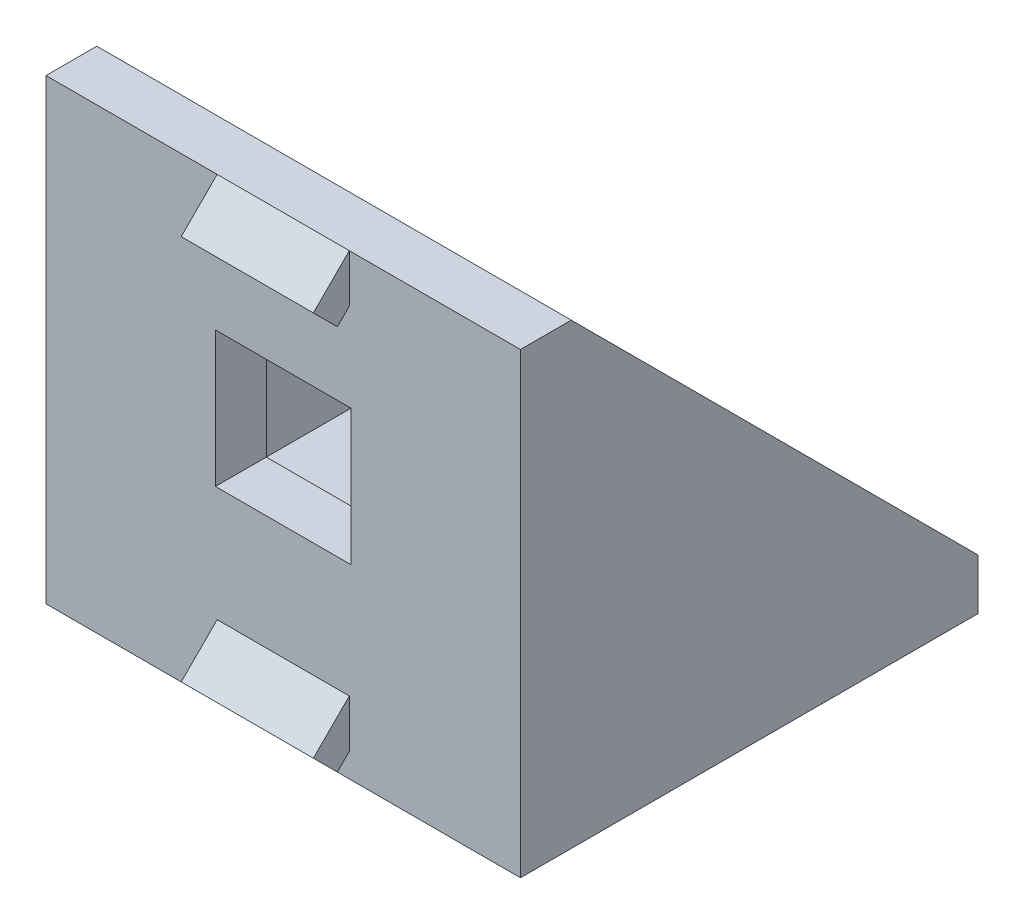
ISO-10303-21;
HEADER;
FILE_DESCRIPTION(('STEP AP214'),'2;1');
FILE_NAME('part.step','',(''),(''),'','','');
FILE_SCHEMA(('AUTOMOTIVE_DESIGN { 1 0 10303 214 1 1 1 1 }'));
ENDSEC;
DATA;
#1=APPLICATION_CONTEXT('core data for automotive mechanical design processes');
#2=APPLICATION_PROTOCOL_DEFINITION('international standard','automotive_design',2000,#1);
#3=PRODUCT_CONTEXT('',#1,'mechanical');
#4=PRODUCT('Part','Part','',(#3));
#5=PRODUCT_RELATED_PRODUCT_CATEGORY('part','',(#4));
#6=PRODUCT_DEFINITION_FORMATION('','',#4);
#7=PRODUCT_DEFINITION_CONTEXT('part definition',#1,'design');
#8=PRODUCT_DEFINITION('design','',#6,#7);
#9=PRODUCT_DEFINITION_SHAPE('','',#8);
#10=(LENGTH_UNIT() NAMED_UNIT(*) SI_UNIT(.MILLI.,.METRE.));
#11=(NAMED_UNIT(*) PLANE_ANGLE_UNIT() SI_UNIT($,.RADIAN.));
#12=(NAMED_UNIT(*) SI_UNIT($,.STERADIAN.) SOLID_ANGLE_UNIT());
#13=UNCERTAINTY_MEASURE_WITH_UNIT(LENGTH_MEASURE(1.E-05),#10,'distance_accuracy_value','');
#14=(GEOMETRIC_REPRESENTATION_CONTEXT(3) GLOBAL_UNCERTAINTY_ASSIGNED_CONTEXT((#13)) GLOBAL_UNIT_ASSIGNED_CONTEXT((#10,
#11,#12)) REPRESENTATION_CONTEXT('',''));
#15=CARTESIAN_POINT('',(0.,0.,0.));
#16=DIRECTION('',(0.,0.,1.));
#17=DIRECTION('',(1.,0.,0.));
#18=AXIS2_PLACEMENT_3D('',#15,#16,#17);
#19=CARTESIAN_POINT('',(28.,0.,0.));
#20=DIRECTION('',(0.,1.,0.));
#21=DIRECTION('',(0.,0.,1.));
#22=AXIS2_PLACEMENT_3D('',#19,#20,#21);
#23=PLANE('',#22);
#24=DIRECTION('',(-1.,0.,0.));
#25=VECTOR('',#24,1.);
#26=CARTESIAN_POINT('',(28.,0.,-27.));
#27=LINE('',#26,#25);
#28=CARTESIAN_POINT('',(10.1,0.,-27.));
#29=VERTEX_POINT('',#28);
#30=CARTESIAN_POINT('',(0.,0.,-27.));
#31=VERTEX_POINT('',#30);
#32=EDGE_CURVE('E571',#29,#31,#27,.T.);
#33=ORIENTED_EDGE('',*,*,#32,.F.);
#34=DIRECTION('',(0.,0.,1.));
#35=VECTOR('',#34,1.);
#36=CARTESIAN_POINT('',(10.1,0.,-24.1715728752538));
#37=LINE('',#36,#35);
#38=CARTESIAN_POINT('',(10.1,0.,-24.1715728752538));
#39=VERTEX_POINT('',#38);
#40=EDGE_CURVE('E365',#29,#39,#37,.T.);
#41=ORIENTED_EDGE('',*,*,#40,.T.);
#42=DIRECTION('',(-1.,0.,0.));
#43=VECTOR('',#42,1.);
#44=CARTESIAN_POINT('',(17.9,0.,-24.1715728752538));
#45=LINE('',#44,#43);
#46=CARTESIAN_POINT('',(17.9,0.,-24.1715728752538));
#47=VERTEX_POINT('',#46);
#48=EDGE_CURVE('E404',#47,#39,#45,.T.);
#49=ORIENTED_EDGE('',*,*,#48,.F.);
#50=DIRECTION('',(0.,0.,1.));
#51=VECTOR('',#50,1.);
#52=CARTESIAN_POINT('',(17.9,0.,-24.1715728752538));
#53=LINE('',#52,#51);
#54=CARTESIAN_POINT('',(17.9,0.,-27.));
#55=VERTEX_POINT('',#54);
#56=EDGE_CURVE('E366',#55,#47,#53,.T.);
#57=ORIENTED_EDGE('',*,*,#56,.F.);
#58=CARTESIAN_POINT('',(28.,0.,-27.));
#59=VERTEX_POINT('',#58);
#60=EDGE_CURVE('E572',#59,#55,#27,.T.);
#61=ORIENTED_EDGE('',*,*,#60,.F.);
#62=DIRECTION('',(0.,0.,-1.));
#63=VECTOR('',#62,1.);
#64=CARTESIAN_POINT('',(28.,0.,0.));
#65=LINE('',#64,#63);
#66=CARTESIAN_POINT('',(28.,0.,0.));
#67=VERTEX_POINT('',#66);
#68=EDGE_CURVE('E519',#67,#59,#65,.T.);
#69=ORIENTED_EDGE('',*,*,#68,.F.);
#70=DIRECTION('',(-1.,0.,0.));
#71=VECTOR('',#70,1.);
#72=CARTESIAN_POINT('',(28.,0.,0.));
#73=LINE('',#72,#71);
#74=CARTESIAN_POINT('',(0.,0.,0.));
#75=VERTEX_POINT('',#74);
#76=EDGE_CURVE('E536',#67,#75,#73,.T.);
#77=ORIENTED_EDGE('',*,*,#76,.T.);
#78=DIRECTION('',(0.,0.,-1.));
#79=VECTOR('',#78,1.);
#80=CARTESIAN_POINT('',(0.,0.,0.));
#81=LINE('',#80,#79);
#82=EDGE_CURVE('E518',#75,#31,#81,.T.);
#83=ORIENTED_EDGE('',*,*,#82,.T.);
#84=EDGE_LOOP('',(#33,#41,#49,#57,#61,#69,#77,#83));
#85=FACE_BOUND('',#84,.T.);
#86=DIRECTION('',(1.,0.,0.));
#87=VECTOR('',#86,1.);
#88=CARTESIAN_POINT('',(10.,0.,-19.));
#89=LINE('',#88,#87);
#90=CARTESIAN_POINT('',(10.,0.,-19.));
#91=VERTEX_POINT('',#90);
#92=CARTESIAN_POINT('',(18.,0.,-19.));
#93=VERTEX_POINT('',#92);
#94=EDGE_CURVE('E411',#91,#93,#89,.T.);
#95=ORIENTED_EDGE('',*,*,#94,.F.);
#96=DIRECTION('',(0.,0.,-1.));
#97=VECTOR('',#96,1.);
#98=CARTESIAN_POINT('',(10.,0.,-11.));
#99=LINE('',#98,#97);
#100=CARTESIAN_POINT('',(10.,0.,-11.));
#101=VERTEX_POINT('',#100);
#102=EDGE_CURVE('E415',#101,#91,#99,.T.);
#103=ORIENTED_EDGE('',*,*,#102,.F.);
#104=DIRECTION('',(-1.,0.,0.));
#105=VECTOR('',#104,1.);
#106=CARTESIAN_POINT('',(10.,0.,-11.));
#107=LINE('',#106,#105);
#108=CARTESIAN_POINT('',(18.,0.,-11.));
#109=VERTEX_POINT('',#108);
#110=EDGE_CURVE('E438',#109,#101,#107,.T.);
#111=ORIENTED_EDGE('',*,*,#110,.F.);
#112=DIRECTION('',(0.,0.,1.));
#113=VECTOR('',#112,1.);
#114=CARTESIAN_POINT('',(18.,0.,-11.));
#115=LINE('',#114,#113);
#116=EDGE_CURVE('E408',#93,#109,#115,.T.);
#117=ORIENTED_EDGE('',*,*,#116,.F.);
#118=EDGE_LOOP('',(#95,#103,#111,#117));
#119=FACE_BOUND('',#118,.T.);
#120=DIRECTION('',(0.,0.,1.));
#121=VECTOR('',#120,1.);
#122=CARTESIAN_POINT('',(17.9,0.,-1.41421356237308));
#123=LINE('',#122,#121);
#124=CARTESIAN_POINT('',(17.9,0.,-4.24264068711928));
#125=VERTEX_POINT('',#124);
#126=CARTESIAN_POINT('',(17.9,0.,-1.41421356237308));
#127=VERTEX_POINT('',#126);
#128=EDGE_CURVE('E325',#125,#127,#123,.T.);
#129=ORIENTED_EDGE('',*,*,#128,.F.);
#130=DIRECTION('',(-1.,0.,0.));
#131=VECTOR('',#130,1.);
#132=CARTESIAN_POINT('',(17.9,0.,-4.24264068711928));
#133=LINE('',#132,#131);
#134=CARTESIAN_POINT('',(10.1,0.,-4.24264068711928));
#135=VERTEX_POINT('',#134);
#136=EDGE_CURVE('E339',#125,#135,#133,.T.);
#137=ORIENTED_EDGE('',*,*,#136,.T.);
#138=DIRECTION('',(0.,0.,1.));
#139=VECTOR('',#138,1.);
#140=CARTESIAN_POINT('',(10.1,0.,-1.41421356237308));
#141=LINE('',#140,#139);
#142=CARTESIAN_POINT('',(10.1,0.,-1.41421356237308));
#143=VERTEX_POINT('',#142);
#144=EDGE_CURVE('E324',#135,#143,#141,.T.);
#145=ORIENTED_EDGE('',*,*,#144,.T.);
#146=DIRECTION('',(-1.,0.,0.));
#147=VECTOR('',#146,1.);
#148=CARTESIAN_POINT('',(17.9,0.,-1.41421356237308));
#149=LINE('',#148,#147);
#150=EDGE_CURVE('E362',#127,#143,#149,.T.);
#151=ORIENTED_EDGE('',*,*,#150,.F.);
#152=EDGE_LOOP('',(#129,#137,#145,#151));
#153=FACE_BOUND('',#152,.T.);
#154=ADVANCED_FACE('F41',(#85,#119,#153),#23,.F.);
#155=CARTESIAN_POINT('',(28.,27.,-3.));
#156=DIRECTION('',(0.,-0.707106781186547,0.707106781186547));
#157=DIRECTION('',(0.,-0.707106781186548,-0.707106781186548));
#158=AXIS2_PLACEMENT_3D('',#155,#156,#157);
#159=PLANE('',#158);
#160=DIRECTION('',(-1.,0.,0.));
#161=VECTOR('',#160,1.);
#162=CARTESIAN_POINT('',(28.,27.,-3.));
#163=LINE('',#162,#161);
#164=CARTESIAN_POINT('',(2.,27.,-3.));
#165=VERTEX_POINT('',#164);
#166=CARTESIAN_POINT('',(0.,27.,-3.));
#167=VERTEX_POINT('',#166);
#168=EDGE_CURVE('E561',#165,#167,#163,.T.);
#169=ORIENTED_EDGE('',*,*,#168,.F.);
#170=DIRECTION('',(0.,-0.707106781186547,-0.707106781186547));
#171=VECTOR('',#170,1.);
#172=CARTESIAN_POINT('',(2.,27.,-3.));
#173=LINE('',#172,#171);
#174=CARTESIAN_POINT('',(2.,3.,-27.));
#175=VERTEX_POINT('',#174);
#176=EDGE_CURVE('E12',#165,#175,#173,.T.);
#177=ORIENTED_EDGE('',*,*,#176,.T.);
#178=DIRECTION('',(-1.,0.,0.));
#179=VECTOR('',#178,1.);
#180=CARTESIAN_POINT('',(28.,3.,-27.));
#181=LINE('',#180,#179);
#182=CARTESIAN_POINT('',(0.,3.,-27.));
#183=VERTEX_POINT('',#182);
#184=EDGE_CURVE('E566',#175,#183,#181,.T.);
#185=ORIENTED_EDGE('',*,*,#184,.T.);
#186=DIRECTION('',(0.,0.707106781186548,0.707106781186548));
#187=VECTOR('',#186,1.);
#188=CARTESIAN_POINT('',(0.,27.,-3.));
#189=LINE('',#188,#187);
#190=EDGE_CURVE('E544',#183,#167,#189,.T.);
#191=ORIENTED_EDGE('',*,*,#190,.T.);
#192=EDGE_LOOP('',(#169,#177,#185,#191));
#193=FACE_BOUND('',#192,.T.);
#194=ADVANCED_FACE('F605',(#193),#159,.F.);
#195=CARTESIAN_POINT('',(28.,3.,-27.));
#196=DIRECTION('',(0.,0.,1.));
#197=DIRECTION('',(1.,0.,0.));
#198=AXIS2_PLACEMENT_3D('',#195,#196,#197);
#199=PLANE('',#198);
#200=DIRECTION('',(0.,1.,0.));
#201=VECTOR('',#200,1.);
#202=CARTESIAN_POINT('',(0.,3.,-27.));
#203=LINE('',#202,#201);
#204=EDGE_CURVE('E540',#31,#183,#203,.T.);
#205=ORIENTED_EDGE('',*,*,#204,.T.);
#206=ORIENTED_EDGE('',*,*,#184,.F.);
#207=DIRECTION('',(-1.,0.,0.));
#208=VECTOR('',#207,1.);
#209=CARTESIAN_POINT('',(2.,3.,-27.));
#210=LINE('',#209,#208);
#211=CARTESIAN_POINT('',(26.,3.,-27.));
#212=VERTEX_POINT('',#211);
#213=EDGE_CURVE('E494',#212,#175,#210,.T.);
#214=ORIENTED_EDGE('',*,*,#213,.F.);
#215=CARTESIAN_POINT('',(28.,3.,-27.));
#216=VERTEX_POINT('',#215);
#217=EDGE_CURVE('E567',#216,#212,#181,.T.);
#218=ORIENTED_EDGE('',*,*,#217,.F.);
#219=DIRECTION('',(0.,1.,0.));
#220=VECTOR('',#219,1.);
#221=CARTESIAN_POINT('',(28.,3.,-27.));
#222=LINE('',#221,#220);
#223=EDGE_CURVE('E523',#59,#216,#222,.T.);
#224=ORIENTED_EDGE('',*,*,#223,.F.);
#225=ORIENTED_EDGE('',*,*,#60,.T.);
#226=DIRECTION('',(-1.,0.,0.));
#227=VECTOR('',#226,1.);
#228=CARTESIAN_POINT('',(17.9,0.,-27.));
#229=LINE('',#228,#227);
#230=EDGE_CURVE('E381',#55,#29,#229,.T.);
#231=ORIENTED_EDGE('',*,*,#230,.T.);
#232=ORIENTED_EDGE('',*,*,#32,.T.);
#233=EDGE_LOOP('',(#205,#206,#214,#218,#224,#225,#231,#232));
#234=FACE_BOUND('',#233,.T.);
#235=ADVANCED_FACE('F597',(#234),#199,.F.);
#236=ORIENTED_EDGE('',*,*,#217,.T.);
#237=DIRECTION('',(0.,0.707106781186547,0.707106781186547));
#238=VECTOR('',#237,1.);
#239=CARTESIAN_POINT('',(26.,27.,-3.));
#240=LINE('',#239,#238);
#241=CARTESIAN_POINT('',(26.,27.,-2.99999999999999));
#242=VERTEX_POINT('',#241);
#243=EDGE_CURVE('E49',#212,#242,#240,.T.);
#244=ORIENTED_EDGE('',*,*,#243,.T.);
#245=CARTESIAN_POINT('',(28.,27.,-3.));
#246=VERTEX_POINT('',#245);
#247=EDGE_CURVE('E562',#246,#242,#163,.T.);
#248=ORIENTED_EDGE('',*,*,#247,.F.);
#249=DIRECTION('',(0.,0.707106781186548,0.707106781186548));
#250=VECTOR('',#249,1.);
#251=CARTESIAN_POINT('',(28.,27.,-3.));
#252=LINE('',#251,#250);
#253=EDGE_CURVE('E527',#216,#246,#252,.T.);
#254=ORIENTED_EDGE('',*,*,#253,.F.);
#255=EDGE_LOOP('',(#236,#244,#248,#254));
#256=FACE_BOUND('',#255,.T.);
#257=ADVANCED_FACE('F579',(#256),#159,.F.);
#258=CARTESIAN_POINT('',(28.,27.,0.));
#259=DIRECTION('',(0.,-1.,0.));
#260=DIRECTION('',(0.,0.,-1.));
#261=AXIS2_PLACEMENT_3D('',#258,#259,#260);
#262=PLANE('',#261);
#263=DIRECTION('',(0.,0.,1.));
#264=VECTOR('',#263,1.);
#265=CARTESIAN_POINT('',(0.,27.,0.));
#266=LINE('',#265,#264);
#267=CARTESIAN_POINT('',(0.,27.,0.));
#268=VERTEX_POINT('',#267);
#269=EDGE_CURVE('E548',#167,#268,#266,.T.);
#270=ORIENTED_EDGE('',*,*,#269,.T.);
#271=DIRECTION('',(-1.,0.,0.));
#272=VECTOR('',#271,1.);
#273=CARTESIAN_POINT('',(28.,27.,0.));
#274=LINE('',#273,#272);
#275=CARTESIAN_POINT('',(10.1,27.,0.));
#276=VERTEX_POINT('',#275);
#277=EDGE_CURVE('E557',#276,#268,#274,.T.);
#278=ORIENTED_EDGE('',*,*,#277,.F.);
#279=DIRECTION('',(-1.,0.,0.));
#280=VECTOR('',#279,1.);
#281=CARTESIAN_POINT('',(17.9,27.,0.));
#282=LINE('',#281,#280);
#283=CARTESIAN_POINT('',(17.9,27.,0.));
#284=VERTEX_POINT('',#283);
#285=EDGE_CURVE('E755',#284,#276,#282,.T.);
#286=ORIENTED_EDGE('',*,*,#285,.F.);
#287=CARTESIAN_POINT('',(28.,27.,0.));
#288=VERTEX_POINT('',#287);
#289=EDGE_CURVE('E558',#288,#284,#274,.T.);
#290=ORIENTED_EDGE('',*,*,#289,.F.);
#291=DIRECTION('',(0.,0.,1.));
#292=VECTOR('',#291,1.);
#293=CARTESIAN_POINT('',(28.,27.,0.));
#294=LINE('',#293,#292);
#295=EDGE_CURVE('E530',#246,#288,#294,.T.);
#296=ORIENTED_EDGE('',*,*,#295,.F.);
#297=ORIENTED_EDGE('',*,*,#247,.T.);
#298=DIRECTION('',(-1.,0.,0.));
#299=VECTOR('',#298,1.);
#300=CARTESIAN_POINT('',(2.,27.,-3.));
#301=LINE('',#300,#299);
#302=EDGE_CURVE('E505',#242,#165,#301,.T.);
#303=ORIENTED_EDGE('',*,*,#302,.T.);
#304=ORIENTED_EDGE('',*,*,#168,.T.);
#305=EDGE_LOOP('',(#270,#278,#286,#290,#296,#297,#303,#304));
#306=FACE_BOUND('',#305,.T.);
#307=ADVANCED_FACE('F586',(#306),#262,.F.);
#308=CARTESIAN_POINT('',(28.,0.,0.));
#309=DIRECTION('',(0.,0.,-1.));
#310=DIRECTION('',(-1.,0.,0.));
#311=AXIS2_PLACEMENT_3D('',#308,#309,#310);
#312=PLANE('',#311);
#313=DIRECTION('',(-1.,0.,0.));
#314=VECTOR('',#313,1.);
#315=CARTESIAN_POINT('',(17.9,4.24264068711882,-1.56502576304842E-13));
#316=LINE('',#315,#314);
#317=CARTESIAN_POINT('',(17.9,4.24264068711866,0.));
#318=VERTEX_POINT('',#317);
#319=CARTESIAN_POINT('',(10.1,4.24264068711882,0.));
#320=VERTEX_POINT('',#319);
#321=EDGE_CURVE('E300',#318,#320,#316,.T.);
#322=ORIENTED_EDGE('',*,*,#321,.F.);
#323=DIRECTION('',(0.,1.,-1.65607518986913E-13));
#324=VECTOR('',#323,1.);
#325=CARTESIAN_POINT('',(17.9,1.4142135623733,3.11906222459551E-13));
#326=LINE('',#325,#324);
#327=CARTESIAN_POINT('',(17.9,1.41421356237361,0.));
#328=VERTEX_POINT('',#327);
#329=EDGE_CURVE('E297',#328,#318,#326,.T.);
#330=ORIENTED_EDGE('',*,*,#329,.F.);
#331=DIRECTION('',(-1.,0.,0.));
#332=VECTOR('',#331,1.);
#333=CARTESIAN_POINT('',(17.9,1.4142135623733,3.11906222459551E-13));
#334=LINE('',#333,#332);
#335=CARTESIAN_POINT('',(10.1,1.4142135623733,3.11906222459551E-13));
#336=VERTEX_POINT('',#335);
#337=EDGE_CURVE('E313',#328,#336,#334,.T.);
#338=ORIENTED_EDGE('',*,*,#337,.T.);
#339=DIRECTION('',(0.,1.,-1.65607518986913E-13));
#340=VECTOR('',#339,1.);
#341=CARTESIAN_POINT('',(10.1,1.4142135623733,3.11906222459551E-13));
#342=LINE('',#341,#340);
#343=EDGE_CURVE('E290',#336,#320,#342,.T.);
#344=ORIENTED_EDGE('',*,*,#343,.T.);
#345=EDGE_LOOP('',(#322,#330,#338,#344));
#346=FACE_BOUND('',#345,.T.);
#347=DIRECTION('',(1.,0.,0.));
#348=VECTOR('',#347,1.);
#349=CARTESIAN_POINT('',(10.,11.,0.));
#350=LINE('',#349,#348);
#351=CARTESIAN_POINT('',(10.,11.,0.));
#352=VERTEX_POINT('',#351);
#353=CARTESIAN_POINT('',(18.,11.,0.));
#354=VERTEX_POINT('',#353);
#355=EDGE_CURVE('E454',#352,#354,#350,.T.);
#356=ORIENTED_EDGE('',*,*,#355,.F.);
#357=DIRECTION('',(0.,-1.,0.));
#358=VECTOR('',#357,1.);
#359=CARTESIAN_POINT('',(10.,19.,0.));
#360=LINE('',#359,#358);
#361=CARTESIAN_POINT('',(10.,19.,0.));
#362=VERTEX_POINT('',#361);
#363=EDGE_CURVE('E458',#362,#352,#360,.T.);
#364=ORIENTED_EDGE('',*,*,#363,.F.);
#365=DIRECTION('',(-1.,0.,0.));
#366=VECTOR('',#365,1.);
#367=CARTESIAN_POINT('',(10.,19.,0.));
#368=LINE('',#367,#366);
#369=CARTESIAN_POINT('',(18.,19.,0.));
#370=VERTEX_POINT('',#369);
#371=EDGE_CURVE('E481',#370,#362,#368,.T.);
#372=ORIENTED_EDGE('',*,*,#371,.F.);
#373=DIRECTION('',(0.,1.,0.));
#374=VECTOR('',#373,1.);
#375=CARTESIAN_POINT('',(18.,19.,0.));
#376=LINE('',#375,#374);
#377=EDGE_CURVE('E451',#354,#370,#376,.T.);
#378=ORIENTED_EDGE('',*,*,#377,.F.);
#379=EDGE_LOOP('',(#356,#364,#372,#378));
#380=FACE_BOUND('',#379,.T.);
#381=ORIENTED_EDGE('',*,*,#289,.T.);
#382=DIRECTION('',(0.,1.,-2.38185905000715E-13));
#383=VECTOR('',#382,1.);
#384=CARTESIAN_POINT('',(17.9,27.,0.));
#385=LINE('',#384,#383);
#386=CARTESIAN_POINT('',(17.9,24.1715728752552,0.));
#387=VERTEX_POINT('',#386);
#388=EDGE_CURVE('E56',#387,#284,#385,.T.);
#389=ORIENTED_EDGE('',*,*,#388,.F.);
#390=DIRECTION('',(-1.,0.,0.));
#391=VECTOR('',#390,1.);
#392=CARTESIAN_POINT('',(17.9,24.1715728752545,6.73691474436078E-13));
#393=LINE('',#392,#391);
#394=CARTESIAN_POINT('',(10.1,24.1715728752545,6.73691474436078E-13));
#395=VERTEX_POINT('',#394);
#396=EDGE_CURVE('E281',#387,#395,#393,.T.);
#397=ORIENTED_EDGE('',*,*,#396,.T.);
#398=DIRECTION('',(0.,1.,-2.38185905000715E-13));
#399=VECTOR('',#398,1.);
#400=CARTESIAN_POINT('',(10.1,27.,0.));
#401=LINE('',#400,#399);
#402=EDGE_CURVE('E62',#395,#276,#401,.T.);
#403=ORIENTED_EDGE('',*,*,#402,.T.);
#404=ORIENTED_EDGE('',*,*,#277,.T.);
#405=DIRECTION('',(0.,-1.,0.));
#406=VECTOR('',#405,1.);
#407=CARTESIAN_POINT('',(0.,0.,0.));
#408=LINE('',#407,#406);
#409=EDGE_CURVE('E524',#268,#75,#408,.T.);
#410=ORIENTED_EDGE('',*,*,#409,.T.);
#411=ORIENTED_EDGE('',*,*,#76,.F.);
#412=DIRECTION('',(0.,-1.,0.));
#413=VECTOR('',#412,1.);
#414=CARTESIAN_POINT('',(28.,0.,0.));
#415=LINE('',#414,#413);
#416=EDGE_CURVE('E533',#288,#67,#415,.T.);
#417=ORIENTED_EDGE('',*,*,#416,.F.);
#418=EDGE_LOOP('',(#381,#389,#397,#403,#404,#410,#411,#417));
#419=FACE_BOUND('',#418,.T.);
#420=ADVANCED_FACE('F731',(#346,#380,#419),#312,.F.);
#421=CARTESIAN_POINT('',(28.,0.,0.));
#422=DIRECTION('',(-1.,0.,0.));
#423=DIRECTION('',(0.,0.,1.));
#424=AXIS2_PLACEMENT_3D('',#421,#422,#423);
#425=PLANE('',#424);
#426=ORIENTED_EDGE('',*,*,#68,.T.);
#427=ORIENTED_EDGE('',*,*,#223,.T.);
#428=ORIENTED_EDGE('',*,*,#253,.T.);
#429=ORIENTED_EDGE('',*,*,#295,.T.);
#430=ORIENTED_EDGE('',*,*,#416,.T.);
#431=EDGE_LOOP('',(#426,#427,#428,#429,#430));
#432=FACE_BOUND('',#431,.T.);
#433=ADVANCED_FACE('F591',(#432),#425,.F.);
#434=CARTESIAN_POINT('',(0.,0.,0.));
#435=DIRECTION('',(-1.,0.,0.));
#436=DIRECTION('',(0.,0.,1.));
#437=AXIS2_PLACEMENT_3D('',#434,#435,#436);
#438=PLANE('',#437);
#439=ORIENTED_EDGE('',*,*,#82,.F.);
#440=ORIENTED_EDGE('',*,*,#409,.F.);
#441=ORIENTED_EDGE('',*,*,#269,.F.);
#442=ORIENTED_EDGE('',*,*,#190,.F.);
#443=ORIENTED_EDGE('',*,*,#204,.F.);
#444=EDGE_LOOP('',(#439,#440,#441,#442,#443));
#445=FACE_BOUND('',#444,.T.);
#446=ADVANCED_FACE('F621',(#445),#438,.T.);
#447=CARTESIAN_POINT('',(2.,3.,33.9411254969543));
#448=DIRECTION('',(-1.,0.,0.));
#449=DIRECTION('',(0.,0.,1.));
#450=AXIS2_PLACEMENT_3D('',#447,#448,#449);
#451=PLANE('',#450);
#452=DIRECTION('',(0.,-1.,0.));
#453=VECTOR('',#452,1.);
#454=CARTESIAN_POINT('',(2.,3.,-3.));
#455=LINE('',#454,#453);
#456=CARTESIAN_POINT('',(2.,3.,-3.));
#457=VERTEX_POINT('',#456);
#458=EDGE_CURVE('E502',#165,#457,#455,.T.);
#459=ORIENTED_EDGE('',*,*,#458,.T.);
#460=DIRECTION('',(0.,0.,-1.));
#461=VECTOR('',#460,1.);
#462=CARTESIAN_POINT('',(2.,3.,33.9411254969543));
#463=LINE('',#462,#461);
#464=EDGE_CURVE('E499',#457,#175,#463,.T.);
#465=ORIENTED_EDGE('',*,*,#464,.T.);
#466=ORIENTED_EDGE('',*,*,#176,.F.);
#467=EDGE_LOOP('',(#459,#465,#466));
#468=FACE_BOUND('',#467,.T.);
#469=ADVANCED_FACE('F607',(#468),#451,.F.);
#470=CARTESIAN_POINT('',(26.,3.,33.9411254969543));
#471=DIRECTION('',(1.,0.,0.));
#472=DIRECTION('',(0.,0.,-1.));
#473=AXIS2_PLACEMENT_3D('',#470,#471,#472);
#474=PLANE('',#473);
#475=DIRECTION('',(0.,0.,-1.));
#476=VECTOR('',#475,1.);
#477=CARTESIAN_POINT('',(26.,3.,33.9411254969543));
#478=LINE('',#477,#476);
#479=CARTESIAN_POINT('',(26.,3.,-3.));
#480=VERTEX_POINT('',#479);
#481=EDGE_CURVE('E509',#480,#212,#478,.T.);
#482=ORIENTED_EDGE('',*,*,#481,.F.);
#483=DIRECTION('',(0.,1.,0.));
#484=VECTOR('',#483,1.);
#485=CARTESIAN_POINT('',(26.,3.,-3.));
#486=LINE('',#485,#484);
#487=EDGE_CURVE('E495',#480,#242,#486,.T.);
#488=ORIENTED_EDGE('',*,*,#487,.T.);
#489=ORIENTED_EDGE('',*,*,#243,.F.);
#490=EDGE_LOOP('',(#482,#488,#489));
#491=FACE_BOUND('',#490,.T.);
#492=ADVANCED_FACE('F612',(#491),#474,.F.);
#493=CARTESIAN_POINT('',(2.,3.,33.9411254969543));
#494=DIRECTION('',(0.,-1.,0.));
#495=DIRECTION('',(1.,0.,0.));
#496=AXIS2_PLACEMENT_3D('',#493,#494,#495);
#497=PLANE('',#496);
#498=DIRECTION('',(1.,0.,0.));
#499=VECTOR('',#498,1.);
#500=CARTESIAN_POINT('',(10.,3.,-11.));
#501=LINE('',#500,#499);
#502=CARTESIAN_POINT('',(10.,3.,-11.));
#503=VERTEX_POINT('',#502);
#504=CARTESIAN_POINT('',(18.,3.,-11.));
#505=VERTEX_POINT('',#504);
#506=EDGE_CURVE('E422',#503,#505,#501,.T.);
#507=ORIENTED_EDGE('',*,*,#506,.F.);
#508=DIRECTION('',(0.,0.,1.));
#509=VECTOR('',#508,1.);
#510=CARTESIAN_POINT('',(10.,3.,-11.));
#511=LINE('',#510,#509);
#512=CARTESIAN_POINT('',(10.,3.,-19.));
#513=VERTEX_POINT('',#512);
#514=EDGE_CURVE('E419',#513,#503,#511,.T.);
#515=ORIENTED_EDGE('',*,*,#514,.F.);
#516=DIRECTION('',(-1.,0.,0.));
#517=VECTOR('',#516,1.);
#518=CARTESIAN_POINT('',(10.,3.,-19.));
#519=LINE('',#518,#517);
#520=CARTESIAN_POINT('',(18.,3.,-19.));
#521=VERTEX_POINT('',#520);
#522=EDGE_CURVE('E430',#521,#513,#519,.T.);
#523=ORIENTED_EDGE('',*,*,#522,.F.);
#524=DIRECTION('',(0.,0.,-1.));
#525=VECTOR('',#524,1.);
#526=CARTESIAN_POINT('',(18.,3.,-11.));
#527=LINE('',#526,#525);
#528=EDGE_CURVE('E426',#505,#521,#527,.T.);
#529=ORIENTED_EDGE('',*,*,#528,.F.);
#530=EDGE_LOOP('',(#507,#515,#523,#529));
#531=FACE_BOUND('',#530,.T.);
#532=DIRECTION('',(1.,0.,0.));
#533=VECTOR('',#532,1.);
#534=CARTESIAN_POINT('',(2.,3.,-3.));
#535=LINE('',#534,#533);
#536=EDGE_CURVE('E498',#457,#480,#535,.T.);
#537=ORIENTED_EDGE('',*,*,#536,.T.);
#538=ORIENTED_EDGE('',*,*,#481,.T.);
#539=ORIENTED_EDGE('',*,*,#213,.T.);
#540=ORIENTED_EDGE('',*,*,#464,.F.);
#541=EDGE_LOOP('',(#537,#538,#539,#540));
#542=FACE_BOUND('',#541,.T.);
#543=ADVANCED_FACE('F601',(#531,#542),#497,.F.);
#544=CARTESIAN_POINT('',(28.,0.,-3.));
#545=DIRECTION('',(0.,0.,-1.));
#546=DIRECTION('',(-1.,0.,0.));
#547=AXIS2_PLACEMENT_3D('',#544,#545,#546);
#548=PLANE('',#547);
#549=DIRECTION('',(0.,1.,0.));
#550=VECTOR('',#549,1.);
#551=CARTESIAN_POINT('',(10.,19.,-3.));
#552=LINE('',#551,#550);
#553=CARTESIAN_POINT('',(10.,11.,-3.));
#554=VERTEX_POINT('',#553);
#555=CARTESIAN_POINT('',(10.,19.,-3.));
#556=VERTEX_POINT('',#555);
#557=EDGE_CURVE('E462',#554,#556,#552,.T.);
#558=ORIENTED_EDGE('',*,*,#557,.F.);
#559=DIRECTION('',(-1.,0.,0.));
#560=VECTOR('',#559,1.);
#561=CARTESIAN_POINT('',(10.,11.,-3.));
#562=LINE('',#561,#560);
#563=CARTESIAN_POINT('',(18.,11.,-3.));
#564=VERTEX_POINT('',#563);
#565=EDGE_CURVE('E473',#564,#554,#562,.T.);
#566=ORIENTED_EDGE('',*,*,#565,.F.);
#567=DIRECTION('',(0.,-1.,0.));
#568=VECTOR('',#567,1.);
#569=CARTESIAN_POINT('',(18.,19.,-3.));
#570=LINE('',#569,#568);
#571=CARTESIAN_POINT('',(18.,19.,-3.));
#572=VERTEX_POINT('',#571);
#573=EDGE_CURVE('E469',#572,#564,#570,.T.);
#574=ORIENTED_EDGE('',*,*,#573,.F.);
#575=DIRECTION('',(1.,0.,0.));
#576=VECTOR('',#575,1.);
#577=CARTESIAN_POINT('',(10.,19.,-3.));
#578=LINE('',#577,#576);
#579=EDGE_CURVE('E465',#556,#572,#578,.T.);
#580=ORIENTED_EDGE('',*,*,#579,.F.);
#581=EDGE_LOOP('',(#558,#566,#574,#580));
#582=FACE_BOUND('',#581,.T.);
#583=ORIENTED_EDGE('',*,*,#458,.F.);
#584=ORIENTED_EDGE('',*,*,#302,.F.);
#585=ORIENTED_EDGE('',*,*,#487,.F.);
#586=ORIENTED_EDGE('',*,*,#536,.F.);
#587=EDGE_LOOP('',(#583,#584,#585,#586));
#588=FACE_BOUND('',#587,.T.);
#589=ADVANCED_FACE('F611',(#582,#588),#548,.T.);
#590=CARTESIAN_POINT('',(10.,19.,0.00100000000000013));
#591=DIRECTION('',(-1.,0.,0.));
#592=DIRECTION('',(0.,-1.,0.));
#593=AXIS2_PLACEMENT_3D('',#590,#591,#592);
#594=PLANE('',#593);
#595=ORIENTED_EDGE('',*,*,#363,.T.);
#596=DIRECTION('',(0.,0.,-1.));
#597=VECTOR('',#596,1.);
#598=CARTESIAN_POINT('',(10.,11.,0.00100000000000013));
#599=LINE('',#598,#597);
#600=EDGE_CURVE('E478',#352,#554,#599,.T.);
#601=ORIENTED_EDGE('',*,*,#600,.T.);
#602=ORIENTED_EDGE('',*,*,#557,.T.);
#603=DIRECTION('',(0.,0.,-1.));
#604=VECTOR('',#603,1.);
#605=CARTESIAN_POINT('',(10.,19.,0.00100000000000013));
#606=LINE('',#605,#604);
#607=EDGE_CURVE('E477',#362,#556,#606,.T.);
#608=ORIENTED_EDGE('',*,*,#607,.F.);
#609=EDGE_LOOP('',(#595,#601,#602,#608));
#610=FACE_BOUND('',#609,.T.);
#611=ADVANCED_FACE('F706',(#610),#594,.F.);
#612=CARTESIAN_POINT('',(10.,11.,0.00100000000000013));
#613=DIRECTION('',(0.,-1.,0.));
#614=DIRECTION('',(1.,0.,0.));
#615=AXIS2_PLACEMENT_3D('',#612,#613,#614);
#616=PLANE('',#615);
#617=ORIENTED_EDGE('',*,*,#355,.T.);
#618=DIRECTION('',(0.,0.,-1.));
#619=VECTOR('',#618,1.);
#620=CARTESIAN_POINT('',(18.,11.,0.00100000000000013));
#621=LINE('',#620,#619);
#622=EDGE_CURVE('E482',#354,#564,#621,.T.);
#623=ORIENTED_EDGE('',*,*,#622,.T.);
#624=ORIENTED_EDGE('',*,*,#565,.T.);
#625=ORIENTED_EDGE('',*,*,#600,.F.);
#626=EDGE_LOOP('',(#617,#623,#624,#625));
#627=FACE_BOUND('',#626,.T.);
#628=ADVANCED_FACE('F702',(#627),#616,.F.);
#629=CARTESIAN_POINT('',(18.,19.,0.00100000000000013));
#630=DIRECTION('',(1.,0.,0.));
#631=DIRECTION('',(0.,0.,-1.));
#632=AXIS2_PLACEMENT_3D('',#629,#630,#631);
#633=PLANE('',#632);
#634=ORIENTED_EDGE('',*,*,#377,.T.);
#635=DIRECTION('',(0.,0.,-1.));
#636=VECTOR('',#635,1.);
#637=CARTESIAN_POINT('',(18.,19.,0.00100000000000013));
#638=LINE('',#637,#636);
#639=EDGE_CURVE('E485',#370,#572,#638,.T.);
#640=ORIENTED_EDGE('',*,*,#639,.T.);
#641=ORIENTED_EDGE('',*,*,#573,.T.);
#642=ORIENTED_EDGE('',*,*,#622,.F.);
#643=EDGE_LOOP('',(#634,#640,#641,#642));
#644=FACE_BOUND('',#643,.T.);
#645=ADVANCED_FACE('F705',(#644),#633,.F.);
#646=CARTESIAN_POINT('',(10.,19.,0.00100000000000013));
#647=DIRECTION('',(0.,1.,0.));
#648=DIRECTION('',(0.,0.,1.));
#649=AXIS2_PLACEMENT_3D('',#646,#647,#648);
#650=PLANE('',#649);
#651=ORIENTED_EDGE('',*,*,#371,.T.);
#652=ORIENTED_EDGE('',*,*,#607,.T.);
#653=ORIENTED_EDGE('',*,*,#579,.T.);
#654=ORIENTED_EDGE('',*,*,#639,.F.);
#655=EDGE_LOOP('',(#651,#652,#653,#654));
#656=FACE_BOUND('',#655,.T.);
#657=ADVANCED_FACE('F700',(#656),#650,.F.);
#658=CARTESIAN_POINT('',(10.,-0.00100000000000057,-11.));
#659=DIRECTION('',(-1.,0.,0.));
#660=DIRECTION('',(0.,-1.,0.));
#661=AXIS2_PLACEMENT_3D('',#658,#659,#660);
#662=PLANE('',#661);
#663=ORIENTED_EDGE('',*,*,#102,.T.);
#664=DIRECTION('',(0.,1.,0.));
#665=VECTOR('',#664,1.);
#666=CARTESIAN_POINT('',(10.,-0.00100000000000057,-19.));
#667=LINE('',#666,#665);
#668=EDGE_CURVE('E435',#91,#513,#667,.T.);
#669=ORIENTED_EDGE('',*,*,#668,.T.);
#670=ORIENTED_EDGE('',*,*,#514,.T.);
#671=DIRECTION('',(0.,1.,0.));
#672=VECTOR('',#671,1.);
#673=CARTESIAN_POINT('',(10.,-0.00100000000000057,-11.));
#674=LINE('',#673,#672);
#675=EDGE_CURVE('E434',#101,#503,#674,.T.);
#676=ORIENTED_EDGE('',*,*,#675,.F.);
#677=EDGE_LOOP('',(#663,#669,#670,#676));
#678=FACE_BOUND('',#677,.T.);
#679=ADVANCED_FACE('F690',(#678),#662,.F.);
#680=CARTESIAN_POINT('',(10.,-0.00100000000000057,-19.));
#681=DIRECTION('',(0.,0.,-1.));
#682=DIRECTION('',(-1.,0.,0.));
#683=AXIS2_PLACEMENT_3D('',#680,#681,#682);
#684=PLANE('',#683);
#685=ORIENTED_EDGE('',*,*,#94,.T.);
#686=DIRECTION('',(0.,1.,0.));
#687=VECTOR('',#686,1.);
#688=CARTESIAN_POINT('',(18.,-0.001000000000001,-19.));
#689=LINE('',#688,#687);
#690=EDGE_CURVE('E439',#93,#521,#689,.T.);
#691=ORIENTED_EDGE('',*,*,#690,.T.);
#692=ORIENTED_EDGE('',*,*,#522,.T.);
#693=ORIENTED_EDGE('',*,*,#668,.F.);
#694=EDGE_LOOP('',(#685,#691,#692,#693));
#695=FACE_BOUND('',#694,.T.);
#696=ADVANCED_FACE('F686',(#695),#684,.F.);
#697=CARTESIAN_POINT('',(18.,-0.001000000000001,-11.));
#698=DIRECTION('',(1.,0.,0.));
#699=DIRECTION('',(0.,1.,0.));
#700=AXIS2_PLACEMENT_3D('',#697,#698,#699);
#701=PLANE('',#700);
#702=ORIENTED_EDGE('',*,*,#116,.T.);
#703=DIRECTION('',(0.,1.,0.));
#704=VECTOR('',#703,1.);
#705=CARTESIAN_POINT('',(18.,-0.001000000000001,-11.));
#706=LINE('',#705,#704);
#707=EDGE_CURVE('E442',#109,#505,#706,.T.);
#708=ORIENTED_EDGE('',*,*,#707,.T.);
#709=ORIENTED_EDGE('',*,*,#528,.T.);
#710=ORIENTED_EDGE('',*,*,#690,.F.);
#711=EDGE_LOOP('',(#702,#708,#709,#710));
#712=FACE_BOUND('',#711,.T.);
#713=ADVANCED_FACE('F689',(#712),#701,.F.);
#714=CARTESIAN_POINT('',(10.,-0.00100000000000057,-11.));
#715=DIRECTION('',(0.,0.,1.));
#716=DIRECTION('',(1.,0.,0.));
#717=AXIS2_PLACEMENT_3D('',#714,#715,#716);
#718=PLANE('',#717);
#719=ORIENTED_EDGE('',*,*,#110,.T.);
#720=ORIENTED_EDGE('',*,*,#675,.T.);
#721=ORIENTED_EDGE('',*,*,#506,.T.);
#722=ORIENTED_EDGE('',*,*,#707,.F.);
#723=EDGE_LOOP('',(#719,#720,#721,#722));
#724=FACE_BOUND('',#723,.T.);
#725=ADVANCED_FACE('F684',(#724),#718,.F.);
#726=CARTESIAN_POINT('',(17.9,-0.707106781186528,-23.4644660940673));
#727=DIRECTION('',(0.,-0.707106781186553,-0.707106781186542));
#728=DIRECTION('',(0.,0.707106781186542,-0.707106781186553));
#729=AXIS2_PLACEMENT_3D('',#726,#727,#728);
#730=PLANE('',#729);
#731=DIRECTION('',(0.,-0.707106781186542,0.707106781186553));
#732=VECTOR('',#731,1.);
#733=CARTESIAN_POINT('',(10.1,-0.707106781186528,-23.4644660940673));
#734=LINE('',#733,#732);
#735=CARTESIAN_POINT('',(10.1,-0.707106781186528,-23.4644660940673));
#736=VERTEX_POINT('',#735);
#737=EDGE_CURVE('E384',#39,#736,#734,.T.);
#738=ORIENTED_EDGE('',*,*,#737,.T.);
#739=DIRECTION('',(-1.,0.,0.));
#740=VECTOR('',#739,1.);
#741=CARTESIAN_POINT('',(17.9,-0.707106781186528,-23.4644660940673));
#742=LINE('',#741,#740);
#743=CARTESIAN_POINT('',(17.9,-0.707106781186528,-23.4644660940673));
#744=VERTEX_POINT('',#743);
#745=EDGE_CURVE('E400',#744,#736,#742,.T.);
#746=ORIENTED_EDGE('',*,*,#745,.F.);
#747=DIRECTION('',(0.,-0.707106781186542,0.707106781186553));
#748=VECTOR('',#747,1.);
#749=CARTESIAN_POINT('',(17.9,-0.707106781186528,-23.4644660940673));
#750=LINE('',#749,#748);
#751=EDGE_CURVE('E370',#47,#744,#750,.T.);
#752=ORIENTED_EDGE('',*,*,#751,.F.);
#753=ORIENTED_EDGE('',*,*,#48,.T.);
#754=EDGE_LOOP('',(#738,#746,#752,#753));
#755=FACE_BOUND('',#754,.T.);
#756=ADVANCED_FACE('F680',(#755),#730,.F.);
#757=CARTESIAN_POINT('',(17.9,-2.12132034355963,-24.8786796564403));
#758=DIRECTION('',(0.,0.707106781186543,-0.707106781186552));
#759=DIRECTION('',(0.,0.707106781186552,0.707106781186543));
#760=AXIS2_PLACEMENT_3D('',#757,#758,#759);
#761=PLANE('',#760);
#762=DIRECTION('',(0.,-0.707106781186552,-0.707106781186543));
#763=VECTOR('',#762,1.);
#764=CARTESIAN_POINT('',(10.1,-2.12132034355963,-24.8786796564403));
#765=LINE('',#764,#763);
#766=CARTESIAN_POINT('',(10.1,-2.12132034355963,-24.8786796564403));
#767=VERTEX_POINT('',#766);
#768=EDGE_CURVE('E387',#736,#767,#765,.T.);
#769=ORIENTED_EDGE('',*,*,#768,.T.);
#770=DIRECTION('',(-1.,0.,0.));
#771=VECTOR('',#770,1.);
#772=CARTESIAN_POINT('',(17.9,-2.12132034355963,-24.8786796564403));
#773=LINE('',#772,#771);
#774=CARTESIAN_POINT('',(17.9,-2.12132034355963,-24.8786796564403));
#775=VERTEX_POINT('',#774);
#776=EDGE_CURVE('E396',#775,#767,#773,.T.);
#777=ORIENTED_EDGE('',*,*,#776,.F.);
#778=DIRECTION('',(0.,-0.707106781186552,-0.707106781186543));
#779=VECTOR('',#778,1.);
#780=CARTESIAN_POINT('',(17.9,-2.12132034355963,-24.8786796564403));
#781=LINE('',#780,#779);
#782=EDGE_CURVE('E374',#744,#775,#781,.T.);
#783=ORIENTED_EDGE('',*,*,#782,.F.);
#784=ORIENTED_EDGE('',*,*,#745,.T.);
#785=EDGE_LOOP('',(#769,#777,#783,#784));
#786=FACE_BOUND('',#785,.T.);
#787=ADVANCED_FACE('F676',(#786),#761,.F.);
#788=CARTESIAN_POINT('',(17.9,0.,-27.));
#789=DIRECTION('',(0.,0.707106781186551,0.707106781186544));
#790=DIRECTION('',(0.,-0.707106781186544,0.707106781186551));
#791=AXIS2_PLACEMENT_3D('',#788,#789,#790);
#792=PLANE('',#791);
#793=DIRECTION('',(0.,0.707106781186544,-0.707106781186551));
#794=VECTOR('',#793,1.);
#795=CARTESIAN_POINT('',(10.1,0.,-27.));
#796=LINE('',#795,#794);
#797=EDGE_CURVE('E371',#767,#29,#796,.T.);
#798=ORIENTED_EDGE('',*,*,#797,.T.);
#799=ORIENTED_EDGE('',*,*,#230,.F.);
#800=DIRECTION('',(0.,0.707106781186544,-0.707106781186551));
#801=VECTOR('',#800,1.);
#802=CARTESIAN_POINT('',(17.9,0.,-27.));
#803=LINE('',#802,#801);
#804=EDGE_CURVE('E377',#775,#55,#803,.T.);
#805=ORIENTED_EDGE('',*,*,#804,.F.);
#806=ORIENTED_EDGE('',*,*,#776,.T.);
#807=EDGE_LOOP('',(#798,#799,#805,#806));
#808=FACE_BOUND('',#807,.T.);
#809=ADVANCED_FACE('F669',(#808),#792,.F.);
#810=CARTESIAN_POINT('',(17.9,0.,0.));
#811=DIRECTION('',(-1.,0.,0.));
#812=DIRECTION('',(0.,0.,1.));
#813=AXIS2_PLACEMENT_3D('',#810,#811,#812);
#814=PLANE('',#813);
#815=ORIENTED_EDGE('',*,*,#56,.T.);
#816=ORIENTED_EDGE('',*,*,#751,.T.);
#817=ORIENTED_EDGE('',*,*,#782,.T.);
#818=ORIENTED_EDGE('',*,*,#804,.T.);
#819=EDGE_LOOP('',(#815,#816,#817,#818));
#820=FACE_BOUND('',#819,.T.);
#821=ADVANCED_FACE('F666',(#820),#814,.F.);
#822=CARTESIAN_POINT('',(10.1,0.,0.));
#823=DIRECTION('',(-1.,0.,0.));
#824=DIRECTION('',(0.,0.,1.));
#825=AXIS2_PLACEMENT_3D('',#822,#823,#824);
#826=PLANE('',#825);
#827=ORIENTED_EDGE('',*,*,#40,.F.);
#828=ORIENTED_EDGE('',*,*,#797,.F.);
#829=ORIENTED_EDGE('',*,*,#768,.F.);
#830=ORIENTED_EDGE('',*,*,#737,.F.);
#831=EDGE_LOOP('',(#827,#828,#829,#830));
#832=FACE_BOUND('',#831,.T.);
#833=ADVANCED_FACE('F662',(#832),#826,.T.);
#834=CARTESIAN_POINT('',(17.9,-0.707106781186547,-0.707106781186547));
#835=DIRECTION('',(0.,-0.707106781186547,-0.707106781186548));
#836=DIRECTION('',(0.,0.707106781186548,-0.707106781186547));
#837=AXIS2_PLACEMENT_3D('',#834,#835,#836);
#838=PLANE('',#837);
#839=DIRECTION('',(0.,-0.707106781186548,0.707106781186547));
#840=VECTOR('',#839,1.);
#841=CARTESIAN_POINT('',(10.1,-0.707106781186547,-0.707106781186547));
#842=LINE('',#841,#840);
#843=CARTESIAN_POINT('',(10.1,-0.707106781186547,-0.707106781186547));
#844=VERTEX_POINT('',#843);
#845=EDGE_CURVE('E343',#143,#844,#842,.T.);
#846=ORIENTED_EDGE('',*,*,#845,.T.);
#847=DIRECTION('',(-1.,0.,0.));
#848=VECTOR('',#847,1.);
#849=CARTESIAN_POINT('',(17.9,-0.707106781186547,-0.707106781186547));
#850=LINE('',#849,#848);
#851=CARTESIAN_POINT('',(17.9,-0.707106781186547,-0.707106781186547));
#852=VERTEX_POINT('',#851);
#853=EDGE_CURVE('E358',#852,#844,#850,.T.);
#854=ORIENTED_EDGE('',*,*,#853,.F.);
#855=DIRECTION('',(0.,-0.707106781186548,0.707106781186547));
#856=VECTOR('',#855,1.);
#857=CARTESIAN_POINT('',(17.9,-0.707106781186547,-0.707106781186547));
#858=LINE('',#857,#856);
#859=EDGE_CURVE('E329',#127,#852,#858,.T.);
#860=ORIENTED_EDGE('',*,*,#859,.F.);
#861=ORIENTED_EDGE('',*,*,#150,.T.);
#862=EDGE_LOOP('',(#846,#854,#860,#861));
#863=FACE_BOUND('',#862,.T.);
#864=ADVANCED_FACE('F652',(#863),#838,.F.);
#865=CARTESIAN_POINT('',(17.9,-2.12132034355964,-2.12132034355964));
#866=DIRECTION('',(0.,0.707106781186548,-0.707106781186547));
#867=DIRECTION('',(0.,0.707106781186547,0.707106781186548));
#868=AXIS2_PLACEMENT_3D('',#865,#866,#867);
#869=PLANE('',#868);
#870=DIRECTION('',(0.,-0.707106781186548,-0.707106781186548));
#871=VECTOR('',#870,1.);
#872=CARTESIAN_POINT('',(10.1,-2.12132034355964,-2.12132034355964));
#873=LINE('',#872,#871);
#874=CARTESIAN_POINT('',(10.1,-2.12132034355964,-2.12132034355964));
#875=VERTEX_POINT('',#874);
#876=EDGE_CURVE('E346',#844,#875,#873,.T.);
#877=ORIENTED_EDGE('',*,*,#876,.T.);
#878=DIRECTION('',(-1.,0.,0.));
#879=VECTOR('',#878,1.);
#880=CARTESIAN_POINT('',(17.9,-2.12132034355964,-2.12132034355964));
#881=LINE('',#880,#879);
#882=CARTESIAN_POINT('',(17.9,-2.12132034355964,-2.12132034355964));
#883=VERTEX_POINT('',#882);
#884=EDGE_CURVE('E354',#883,#875,#881,.T.);
#885=ORIENTED_EDGE('',*,*,#884,.F.);
#886=DIRECTION('',(0.,-0.707106781186548,-0.707106781186548));
#887=VECTOR('',#886,1.);
#888=CARTESIAN_POINT('',(17.9,-2.12132034355964,-2.12132034355964));
#889=LINE('',#888,#887);
#890=EDGE_CURVE('E333',#852,#883,#889,.T.);
#891=ORIENTED_EDGE('',*,*,#890,.F.);
#892=ORIENTED_EDGE('',*,*,#853,.T.);
#893=EDGE_LOOP('',(#877,#885,#891,#892));
#894=FACE_BOUND('',#893,.T.);
#895=ADVANCED_FACE('F654',(#894),#869,.F.);
#896=CARTESIAN_POINT('',(17.9,0.,-4.24264068711928));
#897=DIRECTION('',(0.,0.707106781186547,0.707106781186548));
#898=DIRECTION('',(0.,-0.707106781186548,0.707106781186547));
#899=AXIS2_PLACEMENT_3D('',#896,#897,#898);
#900=PLANE('',#899);
#901=DIRECTION('',(0.,0.707106781186548,-0.707106781186547));
#902=VECTOR('',#901,1.);
#903=CARTESIAN_POINT('',(10.1,0.,-4.24264068711928));
#904=LINE('',#903,#902);
#905=EDGE_CURVE('E330',#875,#135,#904,.T.);
#906=ORIENTED_EDGE('',*,*,#905,.T.);
#907=ORIENTED_EDGE('',*,*,#136,.F.);
#908=DIRECTION('',(0.,0.707106781186548,-0.707106781186547));
#909=VECTOR('',#908,1.);
#910=CARTESIAN_POINT('',(17.9,0.,-4.24264068711928));
#911=LINE('',#910,#909);
#912=EDGE_CURVE('E336',#883,#125,#911,.T.);
#913=ORIENTED_EDGE('',*,*,#912,.F.);
#914=ORIENTED_EDGE('',*,*,#884,.T.);
#915=EDGE_LOOP('',(#906,#907,#913,#914));
#916=FACE_BOUND('',#915,.T.);
#917=ADVANCED_FACE('F644',(#916),#900,.F.);
#918=CARTESIAN_POINT('',(17.9,0.,0.));
#919=DIRECTION('',(-1.,0.,0.));
#920=DIRECTION('',(0.,0.,1.));
#921=AXIS2_PLACEMENT_3D('',#918,#919,#920);
#922=PLANE('',#921);
#923=ORIENTED_EDGE('',*,*,#128,.T.);
#924=ORIENTED_EDGE('',*,*,#859,.T.);
#925=ORIENTED_EDGE('',*,*,#890,.T.);
#926=ORIENTED_EDGE('',*,*,#912,.T.);
#927=EDGE_LOOP('',(#923,#924,#925,#926));
#928=FACE_BOUND('',#927,.T.);
#929=ADVANCED_FACE('F638',(#928),#922,.F.);
#930=CARTESIAN_POINT('',(10.1,0.,0.));
#931=DIRECTION('',(-1.,0.,0.));
#932=DIRECTION('',(0.,0.,1.));
#933=AXIS2_PLACEMENT_3D('',#930,#931,#932);
#934=PLANE('',#933);
#935=ORIENTED_EDGE('',*,*,#144,.F.);
#936=ORIENTED_EDGE('',*,*,#905,.F.);
#937=ORIENTED_EDGE('',*,*,#876,.F.);
#938=ORIENTED_EDGE('',*,*,#845,.F.);
#939=EDGE_LOOP('',(#935,#936,#937,#938));
#940=FACE_BOUND('',#939,.T.);
#941=ADVANCED_FACE('F650',(#940),#934,.T.);
#942=CARTESIAN_POINT('',(17.9,2.12132034355902,2.12132034355933));
#943=DIRECTION('',(0.,-0.707106781186495,-0.7071067811866));
#944=DIRECTION('',(0.,0.7071067811866,-0.707106781186496));
#945=AXIS2_PLACEMENT_3D('',#942,#943,#944);
#946=PLANE('',#945);
#947=DIRECTION('',(0.,-0.7071067811866,0.707106781186496));
#948=VECTOR('',#947,1.);
#949=CARTESIAN_POINT('',(10.1,2.12132034355902,2.12132034355933));
#950=LINE('',#949,#948);
#951=CARTESIAN_POINT('',(10.1,2.12132034355902,2.12132034355933));
#952=VERTEX_POINT('',#951);
#953=EDGE_CURVE('E274',#320,#952,#950,.T.);
#954=ORIENTED_EDGE('',*,*,#953,.T.);
#955=DIRECTION('',(-1.,0.,0.));
#956=VECTOR('',#955,1.);
#957=CARTESIAN_POINT('',(17.9,2.12132034355902,2.12132034355933));
#958=LINE('',#957,#956);
#959=CARTESIAN_POINT('',(17.9,2.12132034355902,2.12132034355933));
#960=VERTEX_POINT('',#959);
#961=EDGE_CURVE('E320',#960,#952,#958,.T.);
#962=ORIENTED_EDGE('',*,*,#961,.F.);
#963=DIRECTION('',(0.,-0.7071067811866,0.707106781186496));
#964=VECTOR('',#963,1.);
#965=CARTESIAN_POINT('',(17.9,2.12132034355902,2.12132034355933));
#966=LINE('',#965,#964);
#967=EDGE_CURVE('E285',#318,#960,#966,.T.);
#968=ORIENTED_EDGE('',*,*,#967,.F.);
#969=ORIENTED_EDGE('',*,*,#321,.T.);
#970=EDGE_LOOP('',(#954,#962,#968,#969));
#971=FACE_BOUND('',#970,.T.);
#972=ADVANCED_FACE('F807',(#971),#946,.F.);
#973=CARTESIAN_POINT('',(17.9,0.707106781186703,0.707106781186807));
#974=DIRECTION('',(0.,0.7071067811866,-0.707106781186495));
#975=DIRECTION('',(0.,0.707106781186495,0.7071067811866));
#976=AXIS2_PLACEMENT_3D('',#973,#974,#975);
#977=PLANE('',#976);
#978=DIRECTION('',(0.,-0.707106781186496,-0.7071067811866));
#979=VECTOR('',#978,1.);
#980=CARTESIAN_POINT('',(10.1,0.707106781186703,0.707106781186807));
#981=LINE('',#980,#979);
#982=CARTESIAN_POINT('',(10.1,0.707106781186703,0.707106781186807));
#983=VERTEX_POINT('',#982);
#984=EDGE_CURVE('E279',#952,#983,#981,.T.);
#985=ORIENTED_EDGE('',*,*,#984,.T.);
#986=DIRECTION('',(-1.,0.,0.));
#987=VECTOR('',#986,1.);
#988=CARTESIAN_POINT('',(17.9,0.707106781186703,0.707106781186807));
#989=LINE('',#988,#987);
#990=CARTESIAN_POINT('',(17.9,0.707106781186703,0.707106781186807));
#991=VERTEX_POINT('',#990);
#992=EDGE_CURVE('E316',#991,#983,#989,.T.);
#993=ORIENTED_EDGE('',*,*,#992,.F.);
#994=DIRECTION('',(0.,-0.707106781186496,-0.7071067811866));
#995=VECTOR('',#994,1.);
#996=CARTESIAN_POINT('',(17.9,0.707106781186703,0.707106781186807));
#997=LINE('',#996,#995);
#998=EDGE_CURVE('E289',#960,#991,#997,.T.);
#999=ORIENTED_EDGE('',*,*,#998,.F.);
#1000=ORIENTED_EDGE('',*,*,#961,.T.);
#1001=EDGE_LOOP('',(#985,#993,#999,#1000));
#1002=FACE_BOUND('',#1001,.T.);
#1003=ADVANCED_FACE('F803',(#1002),#977,.F.);
#1004=CARTESIAN_POINT('',(17.9,1.4142135623733,3.11906222459551E-13));
#1005=DIRECTION('',(0.,0.707106781186496,0.7071067811866));
#1006=DIRECTION('',(0.,-0.7071067811866,0.707106781186496));
#1007=AXIS2_PLACEMENT_3D('',#1004,#1005,#1006);
#1008=PLANE('',#1007);
#1009=DIRECTION('',(0.,0.7071067811866,-0.707106781186496));
#1010=VECTOR('',#1009,1.);
#1011=CARTESIAN_POINT('',(10.1,1.4142135623733,3.11906222459551E-13));
#1012=LINE('',#1011,#1010);
#1013=EDGE_CURVE('E304',#983,#336,#1012,.T.);
#1014=ORIENTED_EDGE('',*,*,#1013,.T.);
#1015=ORIENTED_EDGE('',*,*,#337,.F.);
#1016=DIRECTION('',(0.,0.7071067811866,-0.707106781186496));
#1017=VECTOR('',#1016,1.);
#1018=CARTESIAN_POINT('',(17.9,1.4142135623733,3.11906222459551E-13));
#1019=LINE('',#1018,#1017);
#1020=EDGE_CURVE('E293',#991,#328,#1019,.T.);
#1021=ORIENTED_EDGE('',*,*,#1020,.F.);
#1022=ORIENTED_EDGE('',*,*,#992,.T.);
#1023=EDGE_LOOP('',(#1014,#1015,#1021,#1022));
#1024=FACE_BOUND('',#1023,.T.);
#1025=ADVANCED_FACE('F796',(#1024),#1008,.F.);
#1026=CARTESIAN_POINT('',(17.9,0.,0.));
#1027=DIRECTION('',(1.,0.,0.));
#1028=DIRECTION('',(0.,0.,-1.));
#1029=AXIS2_PLACEMENT_3D('',#1026,#1027,#1028);
#1030=PLANE('',#1029);
#1031=ORIENTED_EDGE('',*,*,#967,.T.);
#1032=ORIENTED_EDGE('',*,*,#998,.T.);
#1033=ORIENTED_EDGE('',*,*,#1020,.T.);
#1034=ORIENTED_EDGE('',*,*,#329,.T.);
#1035=EDGE_LOOP('',(#1031,#1032,#1033,#1034));
#1036=FACE_BOUND('',#1035,.T.);
#1037=ADVANCED_FACE('F793',(#1036),#1030,.T.);
#1038=CARTESIAN_POINT('',(10.1,0.,0.));
#1039=DIRECTION('',(1.,0.,0.));
#1040=DIRECTION('',(0.,0.,-1.));
#1041=AXIS2_PLACEMENT_3D('',#1038,#1039,#1040);
#1042=PLANE('',#1041);
#1043=ORIENTED_EDGE('',*,*,#953,.F.);
#1044=ORIENTED_EDGE('',*,*,#343,.F.);
#1045=ORIENTED_EDGE('',*,*,#1013,.F.);
#1046=ORIENTED_EDGE('',*,*,#984,.F.);
#1047=EDGE_LOOP('',(#1043,#1044,#1045,#1046));
#1048=FACE_BOUND('',#1047,.T.);
#1049=ADVANCED_FACE('F792',(#1048),#1042,.F.);
#1050=CARTESIAN_POINT('',(17.9,24.8786796564404,2.12132034355964));
#1051=DIRECTION('',(0.,-0.707106781186548,-0.707106781186547));
#1052=DIRECTION('',(0.,0.707106781186547,-0.707106781186548));
#1053=AXIS2_PLACEMENT_3D('',#1050,#1051,#1052);
#1054=PLANE('',#1053);
#1055=DIRECTION('',(0.,-0.707106781186547,0.707106781186548));
#1056=VECTOR('',#1055,1.);
#1057=CARTESIAN_POINT('',(10.1,24.8786796564404,2.12132034355964));
#1058=LINE('',#1057,#1056);
#1059=CARTESIAN_POINT('',(10.1,24.8786796564404,2.12132034355964));
#1060=VERTEX_POINT('',#1059);
#1061=EDGE_CURVE('E272',#276,#1060,#1058,.T.);
#1062=ORIENTED_EDGE('',*,*,#1061,.T.);
#1063=DIRECTION('',(-1.,0.,0.));
#1064=VECTOR('',#1063,1.);
#1065=CARTESIAN_POINT('',(17.9,24.8786796564404,2.12132034355964));
#1066=LINE('',#1065,#1064);
#1067=CARTESIAN_POINT('',(17.9,24.8786796564404,2.12132034355964));
#1068=VERTEX_POINT('',#1067);
#1069=EDGE_CURVE('E254',#1068,#1060,#1066,.T.);
#1070=ORIENTED_EDGE('',*,*,#1069,.F.);
#1071=DIRECTION('',(0.,-0.707106781186547,0.707106781186548));
#1072=VECTOR('',#1071,1.);
#1073=CARTESIAN_POINT('',(17.9,24.8786796564404,2.12132034355964));
#1074=LINE('',#1073,#1072);
#1075=EDGE_CURVE('E262',#284,#1068,#1074,.T.);
#1076=ORIENTED_EDGE('',*,*,#1075,.F.);
#1077=ORIENTED_EDGE('',*,*,#285,.T.);
#1078=EDGE_LOOP('',(#1062,#1070,#1076,#1077));
#1079=FACE_BOUND('',#1078,.T.);
#1080=ADVANCED_FACE('F270',(#1079),#1054,.F.);
#1081=CARTESIAN_POINT('',(17.9,23.4644660940679,0.707106781187222));
#1082=DIRECTION('',(0.,0.707106781186549,-0.707106781186546));
#1083=DIRECTION('',(0.,0.707106781186546,0.707106781186549));
#1084=AXIS2_PLACEMENT_3D('',#1081,#1082,#1083);
#1085=PLANE('',#1084);
#1086=DIRECTION('',(0.,-0.707106781186547,-0.707106781186549));
#1087=VECTOR('',#1086,1.);
#1088=CARTESIAN_POINT('',(10.1,23.4644660940679,0.707106781187222));
#1089=LINE('',#1088,#1087);
#1090=CARTESIAN_POINT('',(10.1,23.4644660940679,0.707106781187222));
#1091=VERTEX_POINT('',#1090);
#1092=EDGE_CURVE('E761',#1060,#1091,#1089,.T.);
#1093=ORIENTED_EDGE('',*,*,#1092,.T.);
#1094=DIRECTION('',(-1.,0.,0.));
#1095=VECTOR('',#1094,1.);
#1096=CARTESIAN_POINT('',(17.9,23.4644660940679,0.707106781187222));
#1097=LINE('',#1096,#1095);
#1098=CARTESIAN_POINT('',(17.9,23.4644660940679,0.707106781187222));
#1099=VERTEX_POINT('',#1098);
#1100=EDGE_CURVE('E257',#1099,#1091,#1097,.T.);
#1101=ORIENTED_EDGE('',*,*,#1100,.F.);
#1102=DIRECTION('',(0.,-0.707106781186547,-0.707106781186549));
#1103=VECTOR('',#1102,1.);
#1104=CARTESIAN_POINT('',(17.9,23.4644660940679,0.707106781187222));
#1105=LINE('',#1104,#1103);
#1106=EDGE_CURVE('E250',#1068,#1099,#1105,.T.);
#1107=ORIENTED_EDGE('',*,*,#1106,.F.);
#1108=ORIENTED_EDGE('',*,*,#1069,.T.);
#1109=EDGE_LOOP('',(#1093,#1101,#1107,#1108));
#1110=FACE_BOUND('',#1109,.T.);
#1111=ADVANCED_FACE('F252',(#1110),#1085,.F.);
#1112=CARTESIAN_POINT('',(17.9,24.1715728752545,6.73691474436078E-13));
#1113=DIRECTION('',(0.,0.707106781186546,0.707106781186549));
#1114=DIRECTION('',(0.,-0.707106781186549,0.707106781186546));
#1115=AXIS2_PLACEMENT_3D('',#1112,#1113,#1114);
#1116=PLANE('',#1115);
#1117=DIRECTION('',(0.,0.707106781186549,-0.707106781186546));
#1118=VECTOR('',#1117,1.);
#1119=CARTESIAN_POINT('',(10.1,24.1715728752545,6.73691474436078E-13));
#1120=LINE('',#1119,#1118);
#1121=EDGE_CURVE('E765',#1091,#395,#1120,.T.);
#1122=ORIENTED_EDGE('',*,*,#1121,.T.);
#1123=ORIENTED_EDGE('',*,*,#396,.F.);
#1124=DIRECTION('',(0.,0.707106781186549,-0.707106781186546));
#1125=VECTOR('',#1124,1.);
#1126=CARTESIAN_POINT('',(17.9,24.1715728752545,6.73691474436078E-13));
#1127=LINE('',#1126,#1125);
#1128=EDGE_CURVE('E261',#1099,#387,#1127,.T.);
#1129=ORIENTED_EDGE('',*,*,#1128,.F.);
#1130=ORIENTED_EDGE('',*,*,#1100,.T.);
#1131=EDGE_LOOP('',(#1122,#1123,#1129,#1130));
#1132=FACE_BOUND('',#1131,.T.);
#1133=ADVANCED_FACE('F777',(#1132),#1116,.F.);
#1134=CARTESIAN_POINT('',(17.9,0.,0.));
#1135=DIRECTION('',(1.,0.,0.));
#1136=DIRECTION('',(0.,0.,-1.));
#1137=AXIS2_PLACEMENT_3D('',#1134,#1135,#1136);
#1138=PLANE('',#1137);
#1139=ORIENTED_EDGE('',*,*,#1075,.T.);
#1140=ORIENTED_EDGE('',*,*,#1106,.T.);
#1141=ORIENTED_EDGE('',*,*,#1128,.T.);
#1142=ORIENTED_EDGE('',*,*,#388,.T.);
#1143=EDGE_LOOP('',(#1139,#1140,#1141,#1142));
#1144=FACE_BOUND('',#1143,.T.);
#1145=ADVANCED_FACE('F265',(#1144),#1138,.T.);
#1146=CARTESIAN_POINT('',(10.1,0.,0.));
#1147=DIRECTION('',(1.,0.,0.));
#1148=DIRECTION('',(0.,0.,-1.));
#1149=AXIS2_PLACEMENT_3D('',#1146,#1147,#1148);
#1150=PLANE('',#1149);
#1151=ORIENTED_EDGE('',*,*,#1061,.F.);
#1152=ORIENTED_EDGE('',*,*,#402,.F.);
#1153=ORIENTED_EDGE('',*,*,#1121,.F.);
#1154=ORIENTED_EDGE('',*,*,#1092,.F.);
#1155=EDGE_LOOP('',(#1151,#1152,#1153,#1154));
#1156=FACE_BOUND('',#1155,.T.);
#1157=ADVANCED_FACE('F759',(#1156),#1150,.F.);
#1158=CLOSED_SHELL('',(#154,#194,#235,#257,#307,#420,#433,#446,#469,#492,#543,#589,#611,#628,
#645,#657,#679,#696,#713,#725,#756,#787,#809,#821,#833,#864,#895,#917,#929,#941,#972,#1003,
#1025,#1037,#1049,#1080,#1111,#1133,#1145,#1157));
#1159=MANIFOLD_SOLID_BREP('B2',#1158);
#1160=ADVANCED_BREP_SHAPE_REPRESENTATION('',(#18,#1159),#14);
#1161=SHAPE_DEFINITION_REPRESENTATION(#9,#1160);
ENDSEC;
END-ISO-10303-21;
